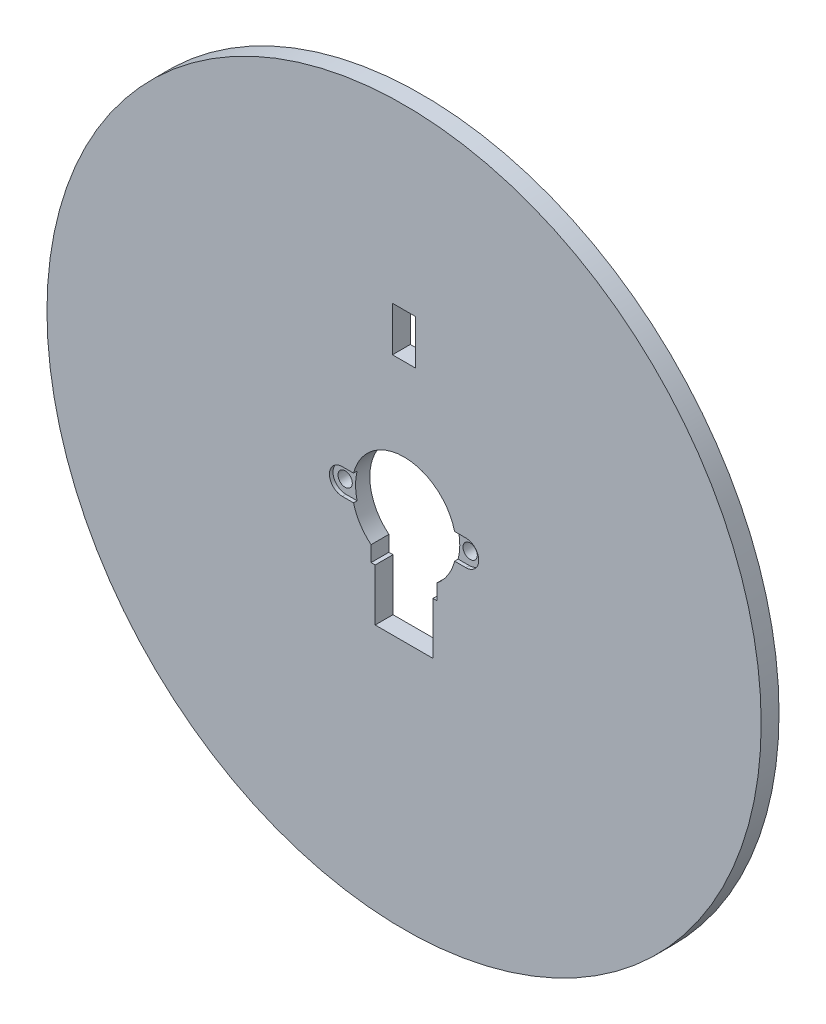
ISO-10303-21;
HEADER;
FILE_DESCRIPTION(('STEP AP214'),'2;1');
FILE_NAME('part.step','',(''),(''),'','','');
FILE_SCHEMA(('AUTOMOTIVE_DESIGN { 1 0 10303 214 1 1 1 1 }'));
ENDSEC;
DATA;
#1=APPLICATION_CONTEXT('core data for automotive mechanical design processes');
#2=APPLICATION_PROTOCOL_DEFINITION('international standard','automotive_design',2000,#1);
#3=PRODUCT_CONTEXT('',#1,'mechanical');
#4=PRODUCT('Part','Part','',(#3));
#5=PRODUCT_RELATED_PRODUCT_CATEGORY('part','',(#4));
#6=PRODUCT_DEFINITION_FORMATION('','',#4);
#7=PRODUCT_DEFINITION_CONTEXT('part definition',#1,'design');
#8=PRODUCT_DEFINITION('design','',#6,#7);
#9=PRODUCT_DEFINITION_SHAPE('','',#8);
#10=(LENGTH_UNIT() NAMED_UNIT(*) SI_UNIT(.MILLI.,.METRE.));
#11=(NAMED_UNIT(*) PLANE_ANGLE_UNIT() SI_UNIT($,.RADIAN.));
#12=(NAMED_UNIT(*) SI_UNIT($,.STERADIAN.) SOLID_ANGLE_UNIT());
#13=UNCERTAINTY_MEASURE_WITH_UNIT(LENGTH_MEASURE(1.E-05),#10,'distance_accuracy_value','');
#14=(GEOMETRIC_REPRESENTATION_CONTEXT(3) GLOBAL_UNCERTAINTY_ASSIGNED_CONTEXT((#13)) GLOBAL_UNIT_ASSIGNED_CONTEXT((#10,
#11,#12)) REPRESENTATION_CONTEXT('',''));
#15=CARTESIAN_POINT('',(0.,0.,0.));
#16=DIRECTION('',(0.,0.,1.));
#17=DIRECTION('',(1.,0.,0.));
#18=AXIS2_PLACEMENT_3D('',#15,#16,#17);
#19=CARTESIAN_POINT('',(0.,0.,0.));
#20=DIRECTION('',(0.,0.,1.));
#21=DIRECTION('',(1.,0.,0.));
#22=AXIS2_PLACEMENT_3D('',#19,#20,#21);
#23=PLANE('',#22);
#24=DIRECTION('',(1.,0.,0.));
#25=VECTOR('',#24,1.);
#26=CARTESIAN_POINT('',(0.,50.25,0.));
#27=LINE('',#26,#25);
#28=CARTESIAN_POINT('',(-3.25,50.25,0.));
#29=VERTEX_POINT('',#28);
#30=CARTESIAN_POINT('',(3.25,50.25,0.));
#31=VERTEX_POINT('',#30);
#32=EDGE_CURVE('E285',#29,#31,#27,.T.);
#33=ORIENTED_EDGE('',*,*,#32,.F.);
#34=DIRECTION('',(0.,-1.,0.));
#35=VECTOR('',#34,1.);
#36=CARTESIAN_POINT('',(-3.25,0.,0.));
#37=LINE('',#36,#35);
#38=CARTESIAN_POINT('',(-3.25,37.75,0.));
#39=VERTEX_POINT('',#38);
#40=EDGE_CURVE('E272',#29,#39,#37,.T.);
#41=ORIENTED_EDGE('',*,*,#40,.T.);
#42=DIRECTION('',(1.,0.,0.));
#43=VECTOR('',#42,1.);
#44=CARTESIAN_POINT('',(0.,37.75,0.));
#45=LINE('',#44,#43);
#46=CARTESIAN_POINT('',(3.25,37.75,0.));
#47=VERTEX_POINT('',#46);
#48=EDGE_CURVE('E277',#39,#47,#45,.T.);
#49=ORIENTED_EDGE('',*,*,#48,.T.);
#50=DIRECTION('',(0.,-1.,0.));
#51=VECTOR('',#50,1.);
#52=CARTESIAN_POINT('',(3.25000000000001,0.,0.));
#53=LINE('',#52,#51);
#54=EDGE_CURVE('E281',#31,#47,#53,.T.);
#55=ORIENTED_EDGE('',*,*,#54,.F.);
#56=EDGE_LOOP('',(#33,#41,#49,#55));
#57=FACE_BOUND('',#56,.T.);
#58=CARTESIAN_POINT('',(0.,0.,0.));
#59=DIRECTION('',(0.,0.,1.));
#60=DIRECTION('',(1.,0.,0.));
#61=AXIS2_PLACEMENT_3D('',#58,#59,#60);
#62=CIRCLE('',#61,100.);
#63=CARTESIAN_POINT('',(100.,0.,0.));
#64=VERTEX_POINT('',#63);
#65=EDGE_CURVE('E289',#64,#64,#62,.T.);
#66=ORIENTED_EDGE('',*,*,#65,.F.);
#67=EDGE_LOOP('',(#66));
#68=FACE_BOUND('',#67,.T.);
#69=DIRECTION('',(0.,-1.,0.));
#70=VECTOR('',#69,1.);
#71=CARTESIAN_POINT('',(9.25000000000001,0.,0.));
#72=LINE('',#71,#70);
#73=CARTESIAN_POINT('',(9.25000000000001,-11.2959063381386,0.));
#74=VERTEX_POINT('',#73);
#75=CARTESIAN_POINT('',(9.25000000000001,-15.6470160944983,0.));
#76=VERTEX_POINT('',#75);
#77=EDGE_CURVE('E318',#74,#76,#72,.T.);
#78=ORIENTED_EDGE('',*,*,#77,.F.);
#79=CARTESIAN_POINT('',(0.,0.,0.));
#80=DIRECTION('',(0.,0.,1.));
#81=DIRECTION('',(1.,0.,0.));
#82=AXIS2_PLACEMENT_3D('',#79,#80,#81);
#83=CIRCLE('',#82,14.6);
#84=CARTESIAN_POINT('',(-9.24999999999999,-11.2959063381386,0.));
#85=VERTEX_POINT('',#84);
#86=EDGE_CURVE('E293',#74,#85,#83,.T.);
#87=ORIENTED_EDGE('',*,*,#86,.T.);
#88=DIRECTION('',(0.,-1.,0.));
#89=VECTOR('',#88,1.);
#90=CARTESIAN_POINT('',(-9.24999999999999,0.,0.));
#91=LINE('',#90,#89);
#92=CARTESIAN_POINT('',(-9.24999999999999,-15.6470160944983,0.));
#93=VERTEX_POINT('',#92);
#94=EDGE_CURVE('E294',#85,#93,#91,.T.);
#95=ORIENTED_EDGE('',*,*,#94,.T.);
#96=DIRECTION('',(-1.,0.,0.));
#97=VECTOR('',#96,1.);
#98=CARTESIAN_POINT('',(0.,-15.6470160944983,0.));
#99=LINE('',#98,#97);
#100=CARTESIAN_POINT('',(-8.09999999999998,-15.6470160944983,0.));
#101=VERTEX_POINT('',#100);
#102=EDGE_CURVE('E298',#101,#93,#99,.T.);
#103=ORIENTED_EDGE('',*,*,#102,.F.);
#104=DIRECTION('',(0.,-1.,0.));
#105=VECTOR('',#104,1.);
#106=CARTESIAN_POINT('',(-8.09999999999998,0.,0.));
#107=LINE('',#106,#105);
#108=CARTESIAN_POINT('',(-8.09999999999998,-30.2,0.));
#109=VERTEX_POINT('',#108);
#110=EDGE_CURVE('E302',#101,#109,#107,.T.);
#111=ORIENTED_EDGE('',*,*,#110,.T.);
#112=DIRECTION('',(1.,0.,0.));
#113=VECTOR('',#112,1.);
#114=CARTESIAN_POINT('',(0.,-30.2,0.));
#115=LINE('',#114,#113);
#116=CARTESIAN_POINT('',(8.1,-30.2,0.));
#117=VERTEX_POINT('',#116);
#118=EDGE_CURVE('E306',#109,#117,#115,.T.);
#119=ORIENTED_EDGE('',*,*,#118,.T.);
#120=DIRECTION('',(0.,-1.,0.));
#121=VECTOR('',#120,1.);
#122=CARTESIAN_POINT('',(8.09999999999999,0.,0.));
#123=LINE('',#122,#121);
#124=CARTESIAN_POINT('',(8.1,-15.6470160944983,0.));
#125=VERTEX_POINT('',#124);
#126=EDGE_CURVE('E310',#125,#117,#123,.T.);
#127=ORIENTED_EDGE('',*,*,#126,.F.);
#128=DIRECTION('',(1.,0.,0.));
#129=VECTOR('',#128,1.);
#130=CARTESIAN_POINT('',(0.,-15.6470160944983,0.));
#131=LINE('',#130,#129);
#132=EDGE_CURVE('E314',#125,#76,#131,.T.);
#133=ORIENTED_EDGE('',*,*,#132,.T.);
#134=EDGE_LOOP('',(#78,#87,#95,#103,#111,#119,#127,#133));
#135=FACE_BOUND('',#134,.T.);
#136=CARTESIAN_POINT('',(0.,56.,0.));
#137=DIRECTION('',(0.,0.,1.));
#138=DIRECTION('',(1.,0.,0.));
#139=AXIS2_PLACEMENT_3D('',#136,#137,#138);
#140=CIRCLE('',#139,2.00000000000001);
#141=CARTESIAN_POINT('',(2.00000000000001,56.,0.));
#142=VERTEX_POINT('',#141);
#143=EDGE_CURVE('E421',#142,#142,#140,.T.);
#144=ORIENTED_EDGE('',*,*,#143,.T.);
#145=EDGE_LOOP('',(#144));
#146=FACE_BOUND('',#145,.T.);
#147=CARTESIAN_POINT('',(0.,32.,0.));
#148=DIRECTION('',(0.,0.,1.));
#149=DIRECTION('',(1.,0.,0.));
#150=AXIS2_PLACEMENT_3D('',#147,#148,#149);
#151=CIRCLE('',#150,2.00000000000001);
#152=CARTESIAN_POINT('',(2.00000000000001,32.,0.));
#153=VERTEX_POINT('',#152);
#154=EDGE_CURVE('E429',#153,#153,#151,.F.);
#155=ORIENTED_EDGE('',*,*,#154,.F.);
#156=EDGE_LOOP('',(#155));
#157=FACE_BOUND('',#156,.T.);
#158=ADVANCED_FACE('F45',(#57,#68,#135,#146,#157),#23,.F.);
#159=CARTESIAN_POINT('',(0.,50.25,5.));
#160=DIRECTION('',(0.,1.,0.));
#161=DIRECTION('',(0.,0.,1.));
#162=AXIS2_PLACEMENT_3D('',#159,#160,#161);
#163=PLANE('',#162);
#164=ORIENTED_EDGE('',*,*,#32,.T.);
#165=DIRECTION('',(0.,0.,-1.));
#166=VECTOR('',#165,1.);
#167=CARTESIAN_POINT('',(3.25,50.25,5.));
#168=LINE('',#167,#166);
#169=CARTESIAN_POINT('',(3.25,50.25,5.));
#170=VERTEX_POINT('',#169);
#171=EDGE_CURVE('E54',#170,#31,#168,.T.);
#172=ORIENTED_EDGE('',*,*,#171,.F.);
#173=DIRECTION('',(1.,0.,0.));
#174=VECTOR('',#173,1.);
#175=CARTESIAN_POINT('',(0.,50.25,5.));
#176=LINE('',#175,#174);
#177=CARTESIAN_POINT('',(-3.25,50.25,5.));
#178=VERTEX_POINT('',#177);
#179=EDGE_CURVE('E336',#178,#170,#176,.T.);
#180=ORIENTED_EDGE('',*,*,#179,.F.);
#181=DIRECTION('',(0.,0.,-1.));
#182=VECTOR('',#181,1.);
#183=CARTESIAN_POINT('',(-3.25,50.25,5.));
#184=LINE('',#183,#182);
#185=EDGE_CURVE('E211',#178,#29,#184,.T.);
#186=ORIENTED_EDGE('',*,*,#185,.T.);
#187=EDGE_LOOP('',(#164,#172,#180,#186));
#188=FACE_BOUND('',#187,.T.);
#189=ADVANCED_FACE('F447',(#188),#163,.F.);
#190=CARTESIAN_POINT('',(3.25000000000001,0.,5.));
#191=DIRECTION('',(1.,0.,0.));
#192=DIRECTION('',(0.,1.,0.));
#193=AXIS2_PLACEMENT_3D('',#190,#191,#192);
#194=PLANE('',#193);
#195=ORIENTED_EDGE('',*,*,#54,.T.);
#196=DIRECTION('',(0.,0.,-1.));
#197=VECTOR('',#196,1.);
#198=CARTESIAN_POINT('',(3.25,37.75,5.));
#199=LINE('',#198,#197);
#200=CARTESIAN_POINT('',(3.25,37.75,5.));
#201=VERTEX_POINT('',#200);
#202=EDGE_CURVE('E267',#201,#47,#199,.T.);
#203=ORIENTED_EDGE('',*,*,#202,.F.);
#204=DIRECTION('',(0.,-1.,0.));
#205=VECTOR('',#204,1.);
#206=CARTESIAN_POINT('',(3.25000000000001,0.,5.));
#207=LINE('',#206,#205);
#208=EDGE_CURVE('E333',#170,#201,#207,.T.);
#209=ORIENTED_EDGE('',*,*,#208,.F.);
#210=ORIENTED_EDGE('',*,*,#171,.T.);
#211=EDGE_LOOP('',(#195,#203,#209,#210));
#212=FACE_BOUND('',#211,.T.);
#213=ADVANCED_FACE('F453',(#212),#194,.F.);
#214=CARTESIAN_POINT('',(0.,37.75,5.));
#215=DIRECTION('',(0.,1.,0.));
#216=DIRECTION('',(0.,0.,1.));
#217=AXIS2_PLACEMENT_3D('',#214,#215,#216);
#218=PLANE('',#217);
#219=ORIENTED_EDGE('',*,*,#48,.F.);
#220=DIRECTION('',(0.,0.,-1.));
#221=VECTOR('',#220,1.);
#222=CARTESIAN_POINT('',(-3.25,37.75,5.));
#223=LINE('',#222,#221);
#224=CARTESIAN_POINT('',(-3.25,37.75,5.));
#225=VERTEX_POINT('',#224);
#226=EDGE_CURVE('E215',#225,#39,#223,.T.);
#227=ORIENTED_EDGE('',*,*,#226,.F.);
#228=DIRECTION('',(1.,0.,0.));
#229=VECTOR('',#228,1.);
#230=CARTESIAN_POINT('',(0.,37.75,5.));
#231=LINE('',#230,#229);
#232=EDGE_CURVE('E329',#225,#201,#231,.T.);
#233=ORIENTED_EDGE('',*,*,#232,.T.);
#234=ORIENTED_EDGE('',*,*,#202,.T.);
#235=EDGE_LOOP('',(#219,#227,#233,#234));
#236=FACE_BOUND('',#235,.T.);
#237=ADVANCED_FACE('F468',(#236),#218,.T.);
#238=CARTESIAN_POINT('',(0.,-3.6,5.));
#239=DIRECTION('',(0.,-1.,0.));
#240=DIRECTION('',(0.,0.,-1.));
#241=AXIS2_PLACEMENT_3D('',#238,#239,#240);
#242=PLANE('',#241);
#243=DIRECTION('',(0.,0.,-1.));
#244=VECTOR('',#243,1.);
#245=CARTESIAN_POINT('',(-14.1492049246592,-3.6,5.));
#246=LINE('',#245,#244);
#247=CARTESIAN_POINT('',(-14.1492049246592,-3.6,5.));
#248=VERTEX_POINT('',#247);
#249=CARTESIAN_POINT('',(-14.1492049246592,-3.6,4.));
#250=VERTEX_POINT('',#249);
#251=EDGE_CURVE('E203',#248,#250,#246,.T.);
#252=ORIENTED_EDGE('',*,*,#251,.T.);
#253=DIRECTION('',(-1.,0.,0.));
#254=VECTOR('',#253,1.);
#255=CARTESIAN_POINT('',(0.,-3.6,4.));
#256=LINE('',#255,#254);
#257=CARTESIAN_POINT('',(-17.3,-3.6,4.));
#258=VERTEX_POINT('',#257);
#259=EDGE_CURVE('E187',#250,#258,#256,.T.);
#260=ORIENTED_EDGE('',*,*,#259,.T.);
#261=DIRECTION('',(0.,0.,-1.));
#262=VECTOR('',#261,1.);
#263=CARTESIAN_POINT('',(-17.3,-3.6,5.));
#264=LINE('',#263,#262);
#265=CARTESIAN_POINT('',(-17.3,-3.6,5.));
#266=VERTEX_POINT('',#265);
#267=EDGE_CURVE('E202',#266,#258,#264,.T.);
#268=ORIENTED_EDGE('',*,*,#267,.F.);
#269=DIRECTION('',(-1.,0.,0.));
#270=VECTOR('',#269,1.);
#271=CARTESIAN_POINT('',(0.,-3.6,5.));
#272=LINE('',#271,#270);
#273=EDGE_CURVE('E276',#248,#266,#272,.T.);
#274=ORIENTED_EDGE('',*,*,#273,.F.);
#275=EDGE_LOOP('',(#252,#260,#268,#274));
#276=FACE_BOUND('',#275,.T.);
#277=ADVANCED_FACE('F47',(#276),#242,.F.);
#278=CARTESIAN_POINT('',(-17.3,0.,5.));
#279=DIRECTION('',(0.,0.,-1.));
#280=DIRECTION('',(-1.,0.,0.));
#281=AXIS2_PLACEMENT_3D('',#278,#279,#280);
#282=CYLINDRICAL_SURFACE('',#281,3.6);
#283=ORIENTED_EDGE('',*,*,#267,.T.);
#284=CARTESIAN_POINT('',(-17.3,0.,4.));
#285=DIRECTION('',(0.,0.,1.));
#286=DIRECTION('',(1.,0.,0.));
#287=AXIS2_PLACEMENT_3D('',#284,#285,#286);
#288=CIRCLE('',#287,3.6);
#289=CARTESIAN_POINT('',(-17.3,3.6,4.));
#290=VERTEX_POINT('',#289);
#291=EDGE_CURVE('E183',#258,#290,#288,.F.);
#292=ORIENTED_EDGE('',*,*,#291,.T.);
#293=DIRECTION('',(0.,0.,-1.));
#294=VECTOR('',#293,1.);
#295=CARTESIAN_POINT('',(-17.3,3.6,5.));
#296=LINE('',#295,#294);
#297=CARTESIAN_POINT('',(-17.3,3.6,5.));
#298=VERTEX_POINT('',#297);
#299=EDGE_CURVE('E212',#298,#290,#296,.T.);
#300=ORIENTED_EDGE('',*,*,#299,.F.);
#301=CARTESIAN_POINT('',(-17.3,0.,5.));
#302=DIRECTION('',(0.,0.,1.));
#303=DIRECTION('',(1.,0.,0.));
#304=AXIS2_PLACEMENT_3D('',#301,#302,#303);
#305=CIRCLE('',#304,3.6);
#306=EDGE_CURVE('E208',#266,#298,#305,.F.);
#307=ORIENTED_EDGE('',*,*,#306,.F.);
#308=EDGE_LOOP('',(#283,#292,#300,#307));
#309=FACE_BOUND('',#308,.T.);
#310=ADVANCED_FACE('F207',(#309),#282,.F.);
#311=CARTESIAN_POINT('',(0.,3.6,5.));
#312=DIRECTION('',(0.,-1.,0.));
#313=DIRECTION('',(0.,0.,-1.));
#314=AXIS2_PLACEMENT_3D('',#311,#312,#313);
#315=PLANE('',#314);
#316=DIRECTION('',(-1.,0.,0.));
#317=VECTOR('',#316,1.);
#318=CARTESIAN_POINT('',(0.,3.6,4.));
#319=LINE('',#318,#317);
#320=CARTESIAN_POINT('',(-14.1492049246592,3.6,4.));
#321=VERTEX_POINT('',#320);
#322=EDGE_CURVE('E190',#321,#290,#319,.T.);
#323=ORIENTED_EDGE('',*,*,#322,.F.);
#324=DIRECTION('',(0.,0.,-1.));
#325=VECTOR('',#324,1.);
#326=CARTESIAN_POINT('',(-14.1492049246592,3.6,5.));
#327=LINE('',#326,#325);
#328=CARTESIAN_POINT('',(-14.1492049246592,3.6,5.));
#329=VERTEX_POINT('',#328);
#330=EDGE_CURVE('E217',#329,#321,#327,.T.);
#331=ORIENTED_EDGE('',*,*,#330,.F.);
#332=DIRECTION('',(-1.,0.,0.));
#333=VECTOR('',#332,1.);
#334=CARTESIAN_POINT('',(0.,3.6,5.));
#335=LINE('',#334,#333);
#336=EDGE_CURVE('E386',#329,#298,#335,.T.);
#337=ORIENTED_EDGE('',*,*,#336,.T.);
#338=ORIENTED_EDGE('',*,*,#299,.T.);
#339=EDGE_LOOP('',(#323,#331,#337,#338));
#340=FACE_BOUND('',#339,.T.);
#341=ADVANCED_FACE('F519',(#340),#315,.T.);
#342=CARTESIAN_POINT('',(0.,3.6,5.));
#343=DIRECTION('',(0.,1.,0.));
#344=DIRECTION('',(0.,0.,1.));
#345=AXIS2_PLACEMENT_3D('',#342,#343,#344);
#346=PLANE('',#345);
#347=DIRECTION('',(0.,0.,-1.));
#348=VECTOR('',#347,1.);
#349=CARTESIAN_POINT('',(14.1492049246592,3.6,5.));
#350=LINE('',#349,#348);
#351=CARTESIAN_POINT('',(14.1492049246592,3.6,5.));
#352=VERTEX_POINT('',#351);
#353=CARTESIAN_POINT('',(14.1492049246592,3.6,4.));
#354=VERTEX_POINT('',#353);
#355=EDGE_CURVE('E223',#352,#354,#350,.T.);
#356=ORIENTED_EDGE('',*,*,#355,.T.);
#357=DIRECTION('',(1.,0.,0.));
#358=VECTOR('',#357,1.);
#359=CARTESIAN_POINT('',(0.,3.6,4.));
#360=LINE('',#359,#358);
#361=CARTESIAN_POINT('',(17.3,3.6,4.));
#362=VERTEX_POINT('',#361);
#363=EDGE_CURVE('E61',#354,#362,#360,.T.);
#364=ORIENTED_EDGE('',*,*,#363,.T.);
#365=DIRECTION('',(0.,0.,-1.));
#366=VECTOR('',#365,1.);
#367=CARTESIAN_POINT('',(17.3,3.6,5.));
#368=LINE('',#367,#366);
#369=CARTESIAN_POINT('',(17.3,3.6,5.));
#370=VERTEX_POINT('',#369);
#371=EDGE_CURVE('E226',#370,#362,#368,.T.);
#372=ORIENTED_EDGE('',*,*,#371,.F.);
#373=DIRECTION('',(1.,0.,0.));
#374=VECTOR('',#373,1.);
#375=CARTESIAN_POINT('',(0.,3.6,5.));
#376=LINE('',#375,#374);
#377=EDGE_CURVE('E379',#352,#370,#376,.T.);
#378=ORIENTED_EDGE('',*,*,#377,.F.);
#379=EDGE_LOOP('',(#356,#364,#372,#378));
#380=FACE_BOUND('',#379,.T.);
#381=ADVANCED_FACE('F516',(#380),#346,.F.);
#382=CARTESIAN_POINT('',(17.3,0.,5.));
#383=DIRECTION('',(0.,0.,-1.));
#384=DIRECTION('',(-1.,0.,0.));
#385=AXIS2_PLACEMENT_3D('',#382,#383,#384);
#386=CYLINDRICAL_SURFACE('',#385,3.6);
#387=CARTESIAN_POINT('',(17.3,0.,4.));
#388=DIRECTION('',(0.,0.,1.));
#389=DIRECTION('',(1.,0.,0.));
#390=AXIS2_PLACEMENT_3D('',#387,#388,#389);
#391=CIRCLE('',#390,3.6);
#392=CARTESIAN_POINT('',(17.3,-3.6,4.));
#393=VERTEX_POINT('',#392);
#394=EDGE_CURVE('E68',#393,#362,#391,.T.);
#395=ORIENTED_EDGE('',*,*,#394,.F.);
#396=DIRECTION('',(0.,0.,-1.));
#397=VECTOR('',#396,1.);
#398=CARTESIAN_POINT('',(17.3,-3.6,5.));
#399=LINE('',#398,#397);
#400=CARTESIAN_POINT('',(17.3,-3.6,5.));
#401=VERTEX_POINT('',#400);
#402=EDGE_CURVE('E229',#401,#393,#399,.T.);
#403=ORIENTED_EDGE('',*,*,#402,.F.);
#404=CARTESIAN_POINT('',(17.3,0.,5.));
#405=DIRECTION('',(0.,0.,1.));
#406=DIRECTION('',(1.,0.,0.));
#407=AXIS2_PLACEMENT_3D('',#404,#405,#406);
#408=CIRCLE('',#407,3.6);
#409=EDGE_CURVE('E375',#401,#370,#408,.T.);
#410=ORIENTED_EDGE('',*,*,#409,.T.);
#411=ORIENTED_EDGE('',*,*,#371,.T.);
#412=EDGE_LOOP('',(#395,#403,#410,#411));
#413=FACE_BOUND('',#412,.T.);
#414=ADVANCED_FACE('F512',(#413),#386,.F.);
#415=CARTESIAN_POINT('',(0.,-3.6,5.));
#416=DIRECTION('',(0.,1.,0.));
#417=DIRECTION('',(0.,0.,1.));
#418=AXIS2_PLACEMENT_3D('',#415,#416,#417);
#419=PLANE('',#418);
#420=DIRECTION('',(1.,0.,0.));
#421=VECTOR('',#420,1.);
#422=CARTESIAN_POINT('',(0.,-3.6,4.));
#423=LINE('',#422,#421);
#424=CARTESIAN_POINT('',(14.1492049246592,-3.6,4.));
#425=VERTEX_POINT('',#424);
#426=EDGE_CURVE('E408',#425,#393,#423,.T.);
#427=ORIENTED_EDGE('',*,*,#426,.F.);
#428=DIRECTION('',(0.,0.,-1.));
#429=VECTOR('',#428,1.);
#430=CARTESIAN_POINT('',(14.1492049246592,-3.6,5.));
#431=LINE('',#430,#429);
#432=CARTESIAN_POINT('',(14.1492049246592,-3.6,5.));
#433=VERTEX_POINT('',#432);
#434=EDGE_CURVE('E232',#433,#425,#431,.T.);
#435=ORIENTED_EDGE('',*,*,#434,.F.);
#436=DIRECTION('',(1.,0.,0.));
#437=VECTOR('',#436,1.);
#438=CARTESIAN_POINT('',(0.,-3.6,5.));
#439=LINE('',#438,#437);
#440=EDGE_CURVE('E371',#433,#401,#439,.T.);
#441=ORIENTED_EDGE('',*,*,#440,.T.);
#442=ORIENTED_EDGE('',*,*,#402,.T.);
#443=EDGE_LOOP('',(#427,#435,#441,#442));
#444=FACE_BOUND('',#443,.T.);
#445=ADVANCED_FACE('F508',(#444),#419,.T.);
#446=CARTESIAN_POINT('',(9.25000000000001,0.,5.));
#447=DIRECTION('',(1.,0.,0.));
#448=DIRECTION('',(0.,0.,-1.));
#449=AXIS2_PLACEMENT_3D('',#446,#447,#448);
#450=PLANE('',#449);
#451=ORIENTED_EDGE('',*,*,#77,.T.);
#452=DIRECTION('',(0.,0.,-1.));
#453=VECTOR('',#452,1.);
#454=CARTESIAN_POINT('',(9.25000000000001,-15.6470160944983,5.));
#455=LINE('',#454,#453);
#456=CARTESIAN_POINT('',(9.25000000000001,-15.6470160944983,5.));
#457=VERTEX_POINT('',#456);
#458=EDGE_CURVE('E240',#457,#76,#455,.T.);
#459=ORIENTED_EDGE('',*,*,#458,.F.);
#460=DIRECTION('',(0.,-1.,0.));
#461=VECTOR('',#460,1.);
#462=CARTESIAN_POINT('',(9.25000000000001,0.,5.));
#463=LINE('',#462,#461);
#464=CARTESIAN_POINT('',(9.25000000000001,-11.2959063381386,5.));
#465=VERTEX_POINT('',#464);
#466=EDGE_CURVE('E367',#465,#457,#463,.T.);
#467=ORIENTED_EDGE('',*,*,#466,.F.);
#468=DIRECTION('',(0.,0.,-1.));
#469=VECTOR('',#468,1.);
#470=CARTESIAN_POINT('',(9.25000000000001,-11.2959063381386,5.));
#471=LINE('',#470,#469);
#472=EDGE_CURVE('E236',#465,#74,#471,.T.);
#473=ORIENTED_EDGE('',*,*,#472,.T.);
#474=EDGE_LOOP('',(#451,#459,#467,#473));
#475=FACE_BOUND('',#474,.T.);
#476=ADVANCED_FACE('F504',(#475),#450,.F.);
#477=CARTESIAN_POINT('',(0.,-15.6470160944983,5.));
#478=DIRECTION('',(0.,1.,0.));
#479=DIRECTION('',(0.,0.,1.));
#480=AXIS2_PLACEMENT_3D('',#477,#478,#479);
#481=PLANE('',#480);
#482=ORIENTED_EDGE('',*,*,#132,.F.);
#483=DIRECTION('',(0.,0.,-1.));
#484=VECTOR('',#483,1.);
#485=CARTESIAN_POINT('',(8.1,-15.6470160944983,5.));
#486=LINE('',#485,#484);
#487=CARTESIAN_POINT('',(8.1,-15.6470160944983,5.));
#488=VERTEX_POINT('',#487);
#489=EDGE_CURVE('E243',#488,#125,#486,.T.);
#490=ORIENTED_EDGE('',*,*,#489,.F.);
#491=DIRECTION('',(1.,0.,0.));
#492=VECTOR('',#491,1.);
#493=CARTESIAN_POINT('',(0.,-15.6470160944983,5.));
#494=LINE('',#493,#492);
#495=EDGE_CURVE('E363',#488,#457,#494,.T.);
#496=ORIENTED_EDGE('',*,*,#495,.T.);
#497=ORIENTED_EDGE('',*,*,#458,.T.);
#498=EDGE_LOOP('',(#482,#490,#496,#497));
#499=FACE_BOUND('',#498,.T.);
#500=ADVANCED_FACE('F500',(#499),#481,.T.);
#501=CARTESIAN_POINT('',(8.09999999999999,0.,5.));
#502=DIRECTION('',(1.,0.,0.));
#503=DIRECTION('',(0.,1.,0.));
#504=AXIS2_PLACEMENT_3D('',#501,#502,#503);
#505=PLANE('',#504);
#506=ORIENTED_EDGE('',*,*,#126,.T.);
#507=DIRECTION('',(0.,0.,-1.));
#508=VECTOR('',#507,1.);
#509=CARTESIAN_POINT('',(8.1,-30.2,5.));
#510=LINE('',#509,#508);
#511=CARTESIAN_POINT('',(8.1,-30.2,5.));
#512=VERTEX_POINT('',#511);
#513=EDGE_CURVE('E246',#512,#117,#510,.T.);
#514=ORIENTED_EDGE('',*,*,#513,.F.);
#515=DIRECTION('',(0.,-1.,0.));
#516=VECTOR('',#515,1.);
#517=CARTESIAN_POINT('',(8.09999999999999,0.,5.));
#518=LINE('',#517,#516);
#519=EDGE_CURVE('E360',#488,#512,#518,.T.);
#520=ORIENTED_EDGE('',*,*,#519,.F.);
#521=ORIENTED_EDGE('',*,*,#489,.T.);
#522=EDGE_LOOP('',(#506,#514,#520,#521));
#523=FACE_BOUND('',#522,.T.);
#524=ADVANCED_FACE('F496',(#523),#505,.F.);
#525=CARTESIAN_POINT('',(0.,-30.2,5.));
#526=DIRECTION('',(0.,1.,0.));
#527=DIRECTION('',(-1.,0.,0.));
#528=AXIS2_PLACEMENT_3D('',#525,#526,#527);
#529=PLANE('',#528);
#530=ORIENTED_EDGE('',*,*,#118,.F.);
#531=DIRECTION('',(0.,0.,-1.));
#532=VECTOR('',#531,1.);
#533=CARTESIAN_POINT('',(-8.09999999999998,-30.2,5.));
#534=LINE('',#533,#532);
#535=CARTESIAN_POINT('',(-8.09999999999998,-30.2,5.));
#536=VERTEX_POINT('',#535);
#537=EDGE_CURVE('E249',#536,#109,#534,.T.);
#538=ORIENTED_EDGE('',*,*,#537,.F.);
#539=DIRECTION('',(1.,0.,0.));
#540=VECTOR('',#539,1.);
#541=CARTESIAN_POINT('',(0.,-30.2,5.));
#542=LINE('',#541,#540);
#543=EDGE_CURVE('E356',#536,#512,#542,.T.);
#544=ORIENTED_EDGE('',*,*,#543,.T.);
#545=ORIENTED_EDGE('',*,*,#513,.T.);
#546=EDGE_LOOP('',(#530,#538,#544,#545));
#547=FACE_BOUND('',#546,.T.);
#548=ADVANCED_FACE('F492',(#547),#529,.T.);
#549=CARTESIAN_POINT('',(-8.09999999999998,0.,5.));
#550=DIRECTION('',(1.,0.,0.));
#551=DIRECTION('',(0.,1.,0.));
#552=AXIS2_PLACEMENT_3D('',#549,#550,#551);
#553=PLANE('',#552);
#554=ORIENTED_EDGE('',*,*,#110,.F.);
#555=DIRECTION('',(0.,0.,-1.));
#556=VECTOR('',#555,1.);
#557=CARTESIAN_POINT('',(-8.09999999999998,-15.6470160944983,5.));
#558=LINE('',#557,#556);
#559=CARTESIAN_POINT('',(-8.09999999999998,-15.6470160944983,5.));
#560=VERTEX_POINT('',#559);
#561=EDGE_CURVE('E252',#560,#101,#558,.T.);
#562=ORIENTED_EDGE('',*,*,#561,.F.);
#563=DIRECTION('',(0.,-1.,0.));
#564=VECTOR('',#563,1.);
#565=CARTESIAN_POINT('',(-8.09999999999998,0.,5.));
#566=LINE('',#565,#564);
#567=EDGE_CURVE('E352',#560,#536,#566,.T.);
#568=ORIENTED_EDGE('',*,*,#567,.T.);
#569=ORIENTED_EDGE('',*,*,#537,.T.);
#570=EDGE_LOOP('',(#554,#562,#568,#569));
#571=FACE_BOUND('',#570,.T.);
#572=ADVANCED_FACE('F488',(#571),#553,.T.);
#573=CARTESIAN_POINT('',(0.,-15.6470160944983,5.));
#574=DIRECTION('',(0.,-1.,0.));
#575=DIRECTION('',(0.,0.,-1.));
#576=AXIS2_PLACEMENT_3D('',#573,#574,#575);
#577=PLANE('',#576);
#578=ORIENTED_EDGE('',*,*,#102,.T.);
#579=DIRECTION('',(0.,0.,-1.));
#580=VECTOR('',#579,1.);
#581=CARTESIAN_POINT('',(-9.24999999999999,-15.6470160944983,5.));
#582=LINE('',#581,#580);
#583=CARTESIAN_POINT('',(-9.24999999999999,-15.6470160944983,5.));
#584=VERTEX_POINT('',#583);
#585=EDGE_CURVE('E255',#584,#93,#582,.T.);
#586=ORIENTED_EDGE('',*,*,#585,.F.);
#587=DIRECTION('',(-1.,0.,0.));
#588=VECTOR('',#587,1.);
#589=CARTESIAN_POINT('',(0.,-15.6470160944983,5.));
#590=LINE('',#589,#588);
#591=EDGE_CURVE('E349',#560,#584,#590,.T.);
#592=ORIENTED_EDGE('',*,*,#591,.F.);
#593=ORIENTED_EDGE('',*,*,#561,.T.);
#594=EDGE_LOOP('',(#578,#586,#592,#593));
#595=FACE_BOUND('',#594,.T.);
#596=ADVANCED_FACE('F484',(#595),#577,.F.);
#597=CARTESIAN_POINT('',(-9.24999999999999,0.,5.));
#598=DIRECTION('',(1.,0.,0.));
#599=DIRECTION('',(0.,0.,-1.));
#600=AXIS2_PLACEMENT_3D('',#597,#598,#599);
#601=PLANE('',#600);
#602=ORIENTED_EDGE('',*,*,#94,.F.);
#603=DIRECTION('',(0.,0.,-1.));
#604=VECTOR('',#603,1.);
#605=CARTESIAN_POINT('',(-9.24999999999999,-11.2959063381386,5.));
#606=LINE('',#605,#604);
#607=CARTESIAN_POINT('',(-9.24999999999999,-11.2959063381386,5.));
#608=VERTEX_POINT('',#607);
#609=EDGE_CURVE('E258',#608,#85,#606,.T.);
#610=ORIENTED_EDGE('',*,*,#609,.F.);
#611=DIRECTION('',(0.,-1.,0.));
#612=VECTOR('',#611,1.);
#613=CARTESIAN_POINT('',(-9.24999999999999,0.,5.));
#614=LINE('',#613,#612);
#615=EDGE_CURVE('E345',#608,#584,#614,.T.);
#616=ORIENTED_EDGE('',*,*,#615,.T.);
#617=ORIENTED_EDGE('',*,*,#585,.T.);
#618=EDGE_LOOP('',(#602,#610,#616,#617));
#619=FACE_BOUND('',#618,.T.);
#620=ADVANCED_FACE('F466',(#619),#601,.T.);
#621=CARTESIAN_POINT('',(-3.25,0.,5.));
#622=DIRECTION('',(1.,0.,0.));
#623=DIRECTION('',(0.,0.,-1.));
#624=AXIS2_PLACEMENT_3D('',#621,#622,#623);
#625=PLANE('',#624);
#626=ORIENTED_EDGE('',*,*,#40,.F.);
#627=ORIENTED_EDGE('',*,*,#185,.F.);
#628=DIRECTION('',(0.,-1.,0.));
#629=VECTOR('',#628,1.);
#630=CARTESIAN_POINT('',(-3.25,0.,5.));
#631=LINE('',#630,#629);
#632=EDGE_CURVE('E263',#178,#225,#631,.T.);
#633=ORIENTED_EDGE('',*,*,#632,.T.);
#634=ORIENTED_EDGE('',*,*,#226,.T.);
#635=EDGE_LOOP('',(#626,#627,#633,#634));
#636=FACE_BOUND('',#635,.T.);
#637=ADVANCED_FACE('F462',(#636),#625,.T.);
#638=CARTESIAN_POINT('',(0.,0.,5.));
#639=DIRECTION('',(0.,0.,-1.));
#640=DIRECTION('',(-1.,0.,0.));
#641=AXIS2_PLACEMENT_3D('',#638,#639,#640);
#642=CYLINDRICAL_SURFACE('',#641,100.);
#643=CARTESIAN_POINT('',(0.,0.,5.));
#644=DIRECTION('',(0.,0.,1.));
#645=DIRECTION('',(1.,0.,0.));
#646=AXIS2_PLACEMENT_3D('',#643,#644,#645);
#647=CIRCLE('',#646,100.);
#648=CARTESIAN_POINT('',(100.,0.,5.));
#649=VERTEX_POINT('',#648);
#650=EDGE_CURVE('E340',#649,#649,#647,.T.);
#651=ORIENTED_EDGE('',*,*,#650,.F.);
#652=EDGE_LOOP('',(#651));
#653=FACE_BOUND('',#652,.T.);
#654=ORIENTED_EDGE('',*,*,#65,.T.);
#655=EDGE_LOOP('',(#654));
#656=FACE_BOUND('',#655,.T.);
#657=ADVANCED_FACE('F465',(#653,#656),#642,.T.);
#658=CARTESIAN_POINT('',(0.,0.,5.));
#659=DIRECTION('',(0.,0.,-1.));
#660=DIRECTION('',(-1.,0.,0.));
#661=AXIS2_PLACEMENT_3D('',#658,#659,#660);
#662=CYLINDRICAL_SURFACE('',#661,14.6);
#663=ORIENTED_EDGE('',*,*,#86,.F.);
#664=ORIENTED_EDGE('',*,*,#472,.F.);
#665=CARTESIAN_POINT('',(0.,0.,5.));
#666=DIRECTION('',(0.,0.,1.));
#667=DIRECTION('',(1.,0.,0.));
#668=AXIS2_PLACEMENT_3D('',#665,#666,#667);
#669=CIRCLE('',#668,14.6);
#670=EDGE_CURVE('E370',#465,#433,#669,.T.);
#671=ORIENTED_EDGE('',*,*,#670,.T.);
#672=ORIENTED_EDGE('',*,*,#434,.T.);
#673=CARTESIAN_POINT('',(0.,0.,4.));
#674=DIRECTION('',(0.,0.,1.));
#675=DIRECTION('',(1.,0.,0.));
#676=AXIS2_PLACEMENT_3D('',#673,#674,#675);
#677=CIRCLE('',#676,14.6);
#678=EDGE_CURVE('E196',#425,#354,#677,.T.);
#679=ORIENTED_EDGE('',*,*,#678,.T.);
#680=ORIENTED_EDGE('',*,*,#355,.F.);
#681=EDGE_CURVE('E382',#352,#329,#669,.T.);
#682=ORIENTED_EDGE('',*,*,#681,.T.);
#683=ORIENTED_EDGE('',*,*,#330,.T.);
#684=CARTESIAN_POINT('',(0.,0.,4.));
#685=DIRECTION('',(0.,0.,1.));
#686=DIRECTION('',(1.,0.,0.));
#687=AXIS2_PLACEMENT_3D('',#684,#685,#686);
#688=CIRCLE('',#687,14.6);
#689=EDGE_CURVE('E205',#321,#250,#688,.T.);
#690=ORIENTED_EDGE('',*,*,#689,.T.);
#691=ORIENTED_EDGE('',*,*,#251,.F.);
#692=EDGE_CURVE('E344',#248,#608,#669,.T.);
#693=ORIENTED_EDGE('',*,*,#692,.T.);
#694=ORIENTED_EDGE('',*,*,#609,.T.);
#695=EDGE_LOOP('',(#663,#664,#671,#672,#679,#680,#682,#683,#690,#691,#693,#694));
#696=FACE_BOUND('',#695,.T.);
#697=ADVANCED_FACE('F477',(#696),#662,.F.);
#698=CARTESIAN_POINT('',(0.,0.,5.));
#699=DIRECTION('',(0.,0.,1.));
#700=DIRECTION('',(1.,0.,0.));
#701=AXIS2_PLACEMENT_3D('',#698,#699,#700);
#702=PLANE('',#701);
#703=ORIENTED_EDGE('',*,*,#273,.T.);
#704=ORIENTED_EDGE('',*,*,#306,.T.);
#705=ORIENTED_EDGE('',*,*,#336,.F.);
#706=ORIENTED_EDGE('',*,*,#681,.F.);
#707=ORIENTED_EDGE('',*,*,#377,.T.);
#708=ORIENTED_EDGE('',*,*,#409,.F.);
#709=ORIENTED_EDGE('',*,*,#440,.F.);
#710=ORIENTED_EDGE('',*,*,#670,.F.);
#711=ORIENTED_EDGE('',*,*,#466,.T.);
#712=ORIENTED_EDGE('',*,*,#495,.F.);
#713=ORIENTED_EDGE('',*,*,#519,.T.);
#714=ORIENTED_EDGE('',*,*,#543,.F.);
#715=ORIENTED_EDGE('',*,*,#567,.F.);
#716=ORIENTED_EDGE('',*,*,#591,.T.);
#717=ORIENTED_EDGE('',*,*,#615,.F.);
#718=ORIENTED_EDGE('',*,*,#692,.F.);
#719=EDGE_LOOP('',(#703,#704,#705,#706,#707,#708,#709,#710,#711,#712,#713,#714,#715,#716,#717,#718));
#720=FACE_BOUND('',#719,.T.);
#721=ORIENTED_EDGE('',*,*,#650,.T.);
#722=EDGE_LOOP('',(#721));
#723=FACE_BOUND('',#722,.T.);
#724=ORIENTED_EDGE('',*,*,#179,.T.);
#725=ORIENTED_EDGE('',*,*,#208,.T.);
#726=ORIENTED_EDGE('',*,*,#232,.F.);
#727=ORIENTED_EDGE('',*,*,#632,.F.);
#728=EDGE_LOOP('',(#724,#725,#726,#727));
#729=FACE_BOUND('',#728,.T.);
#730=ADVANCED_FACE('F460',(#720,#723,#729),#702,.T.);
#731=CARTESIAN_POINT('',(-17.5,0.,4.));
#732=DIRECTION('',(0.,0.,-1.));
#733=DIRECTION('',(-1.,0.,0.));
#734=AXIS2_PLACEMENT_3D('',#731,#732,#733);
#735=CYLINDRICAL_SURFACE('',#734,2.00000000000003);
#736=CARTESIAN_POINT('',(-17.5,0.,1.));
#737=DIRECTION('',(0.,0.,1.));
#738=DIRECTION('',(1.,0.,0.));
#739=AXIS2_PLACEMENT_3D('',#736,#737,#738);
#740=CIRCLE('',#739,2.00000000000003);
#741=CARTESIAN_POINT('',(-15.4999999999999,0.,1.));
#742=VERTEX_POINT('',#741);
#743=EDGE_CURVE('E416',#742,#742,#740,.F.);
#744=ORIENTED_EDGE('',*,*,#743,.T.);
#745=EDGE_LOOP('',(#744));
#746=FACE_BOUND('',#745,.T.);
#747=CARTESIAN_POINT('',(-17.5,0.,4.));
#748=DIRECTION('',(0.,0.,1.));
#749=DIRECTION('',(1.,0.,0.));
#750=AXIS2_PLACEMENT_3D('',#747,#748,#749);
#751=CIRCLE('',#750,2.00000000000003);
#752=CARTESIAN_POINT('',(-15.4999999999999,0.,4.));
#753=VERTEX_POINT('',#752);
#754=EDGE_CURVE('E322',#753,#753,#751,.F.);
#755=ORIENTED_EDGE('',*,*,#754,.F.);
#756=EDGE_LOOP('',(#755));
#757=FACE_BOUND('',#756,.T.);
#758=ADVANCED_FACE('F671',(#746,#757),#735,.F.);
#759=CARTESIAN_POINT('',(0.,0.,4.));
#760=DIRECTION('',(0.,0.,1.));
#761=DIRECTION('',(1.,0.,0.));
#762=AXIS2_PLACEMENT_3D('',#759,#760,#761);
#763=PLANE('',#762);
#764=ORIENTED_EDGE('',*,*,#291,.F.);
#765=ORIENTED_EDGE('',*,*,#259,.F.);
#766=ORIENTED_EDGE('',*,*,#689,.F.);
#767=ORIENTED_EDGE('',*,*,#322,.T.);
#768=EDGE_LOOP('',(#764,#765,#766,#767));
#769=FACE_BOUND('',#768,.T.);
#770=ORIENTED_EDGE('',*,*,#754,.T.);
#771=EDGE_LOOP('',(#770));
#772=FACE_BOUND('',#771,.T.);
#773=ADVANCED_FACE('F185',(#769,#772),#763,.T.);
#774=CARTESIAN_POINT('',(17.5,0.,4.));
#775=DIRECTION('',(0.,0.,-1.));
#776=DIRECTION('',(-1.,0.,0.));
#777=AXIS2_PLACEMENT_3D('',#774,#775,#776);
#778=CYLINDRICAL_SURFACE('',#777,2.00000000000003);
#779=CARTESIAN_POINT('',(17.5,0.,1.));
#780=DIRECTION('',(0.,0.,1.));
#781=DIRECTION('',(1.,0.,0.));
#782=AXIS2_PLACEMENT_3D('',#779,#780,#781);
#783=CIRCLE('',#782,2.00000000000003);
#784=CARTESIAN_POINT('',(19.5,0.,1.));
#785=VERTEX_POINT('',#784);
#786=EDGE_CURVE('E11',#785,#785,#783,.T.);
#787=ORIENTED_EDGE('',*,*,#786,.F.);
#788=EDGE_LOOP('',(#787));
#789=FACE_BOUND('',#788,.T.);
#790=CARTESIAN_POINT('',(17.5,0.,4.));
#791=DIRECTION('',(0.,0.,1.));
#792=DIRECTION('',(1.,0.,0.));
#793=AXIS2_PLACEMENT_3D('',#790,#791,#792);
#794=CIRCLE('',#793,2.00000000000003);
#795=CARTESIAN_POINT('',(19.5,0.,4.));
#796=VERTEX_POINT('',#795);
#797=EDGE_CURVE('E412',#796,#796,#794,.T.);
#798=ORIENTED_EDGE('',*,*,#797,.T.);
#799=EDGE_LOOP('',(#798));
#800=FACE_BOUND('',#799,.T.);
#801=ADVANCED_FACE('F715',(#789,#800),#778,.F.);
#802=CARTESIAN_POINT('',(0.,0.,4.));
#803=DIRECTION('',(0.,0.,1.));
#804=DIRECTION('',(1.,0.,0.));
#805=AXIS2_PLACEMENT_3D('',#802,#803,#804);
#806=PLANE('',#805);
#807=ORIENTED_EDGE('',*,*,#797,.F.);
#808=EDGE_LOOP('',(#807));
#809=FACE_BOUND('',#808,.T.);
#810=ORIENTED_EDGE('',*,*,#426,.T.);
#811=ORIENTED_EDGE('',*,*,#394,.T.);
#812=ORIENTED_EDGE('',*,*,#363,.F.);
#813=ORIENTED_EDGE('',*,*,#678,.F.);
#814=EDGE_LOOP('',(#810,#811,#812,#813));
#815=FACE_BOUND('',#814,.T.);
#816=ADVANCED_FACE('F703',(#809,#815),#806,.T.);
#817=CARTESIAN_POINT('',(0.,0.,1.));
#818=DIRECTION('',(0.,0.,1.));
#819=DIRECTION('',(1.,0.,0.));
#820=AXIS2_PLACEMENT_3D('',#817,#818,#819);
#821=PLANE('',#820);
#822=ORIENTED_EDGE('',*,*,#743,.F.);
#823=EDGE_LOOP('',(#822));
#824=FACE_BOUND('',#823,.T.);
#825=ADVANCED_FACE('F691',(#824),#821,.T.);
#826=CARTESIAN_POINT('',(0.,0.,1.));
#827=DIRECTION('',(0.,0.,1.));
#828=DIRECTION('',(1.,0.,0.));
#829=AXIS2_PLACEMENT_3D('',#826,#827,#828);
#830=PLANE('',#829);
#831=ORIENTED_EDGE('',*,*,#786,.T.);
#832=EDGE_LOOP('',(#831));
#833=FACE_BOUND('',#832,.T.);
#834=ADVANCED_FACE('F683',(#833),#830,.T.);
#835=CARTESIAN_POINT('',(0.,56.,3.));
#836=DIRECTION('',(0.,0.,-1.));
#837=DIRECTION('',(-1.,0.,0.));
#838=AXIS2_PLACEMENT_3D('',#835,#836,#837);
#839=CYLINDRICAL_SURFACE('',#838,2.00000000000001);
#840=CARTESIAN_POINT('',(0.,56.,3.));
#841=DIRECTION('',(0.,0.,1.));
#842=DIRECTION('',(1.,0.,0.));
#843=AXIS2_PLACEMENT_3D('',#840,#841,#842);
#844=CIRCLE('',#843,2.00000000000001);
#845=CARTESIAN_POINT('',(2.00000000000001,56.,3.));
#846=VERTEX_POINT('',#845);
#847=EDGE_CURVE('E425',#846,#846,#844,.T.);
#848=ORIENTED_EDGE('',*,*,#847,.T.);
#849=EDGE_LOOP('',(#848));
#850=FACE_BOUND('',#849,.T.);
#851=ORIENTED_EDGE('',*,*,#143,.F.);
#852=EDGE_LOOP('',(#851));
#853=FACE_BOUND('',#852,.T.);
#854=ADVANCED_FACE('F690',(#850,#853),#839,.F.);
#855=CARTESIAN_POINT('',(0.,0.,3.));
#856=DIRECTION('',(0.,0.,1.));
#857=DIRECTION('',(1.,0.,0.));
#858=AXIS2_PLACEMENT_3D('',#855,#856,#857);
#859=PLANE('',#858);
#860=ORIENTED_EDGE('',*,*,#847,.F.);
#861=EDGE_LOOP('',(#860));
#862=FACE_BOUND('',#861,.T.);
#863=ADVANCED_FACE('F442',(#862),#859,.F.);
#864=CARTESIAN_POINT('',(0.,32.,3.));
#865=DIRECTION('',(0.,0.,-1.));
#866=DIRECTION('',(-1.,0.,0.));
#867=AXIS2_PLACEMENT_3D('',#864,#865,#866);
#868=CYLINDRICAL_SURFACE('',#867,2.00000000000001);
#869=CARTESIAN_POINT('',(0.,32.,3.));
#870=DIRECTION('',(0.,0.,1.));
#871=DIRECTION('',(1.,0.,0.));
#872=AXIS2_PLACEMENT_3D('',#869,#870,#871);
#873=CIRCLE('',#872,2.00000000000001);
#874=CARTESIAN_POINT('',(2.00000000000001,32.,3.));
#875=VERTEX_POINT('',#874);
#876=EDGE_CURVE('E420',#875,#875,#873,.F.);
#877=ORIENTED_EDGE('',*,*,#876,.F.);
#878=EDGE_LOOP('',(#877));
#879=FACE_BOUND('',#878,.T.);
#880=ORIENTED_EDGE('',*,*,#154,.T.);
#881=EDGE_LOOP('',(#880));
#882=FACE_BOUND('',#881,.T.);
#883=ADVANCED_FACE('F439',(#879,#882),#868,.F.);
#884=CARTESIAN_POINT('',(0.,0.,3.));
#885=DIRECTION('',(0.,0.,1.));
#886=DIRECTION('',(1.,0.,0.));
#887=AXIS2_PLACEMENT_3D('',#884,#885,#886);
#888=PLANE('',#887);
#889=ORIENTED_EDGE('',*,*,#876,.T.);
#890=EDGE_LOOP('',(#889));
#891=FACE_BOUND('',#890,.T.);
#892=ADVANCED_FACE('F437',(#891),#888,.F.);
#893=CLOSED_SHELL('',(#158,#189,#213,#237,#277,#310,#341,#381,#414,#445,#476,#500,#524,#548,
#572,#596,#620,#637,#657,#697,#730,#758,#773,#801,#816,#825,#834,#854,#863,#883,#892));
#894=MANIFOLD_SOLID_BREP('B2',#893);
#895=ADVANCED_BREP_SHAPE_REPRESENTATION('',(#18,#894),#14);
#896=SHAPE_DEFINITION_REPRESENTATION(#9,#895);
ENDSEC;
END-ISO-10303-21;
